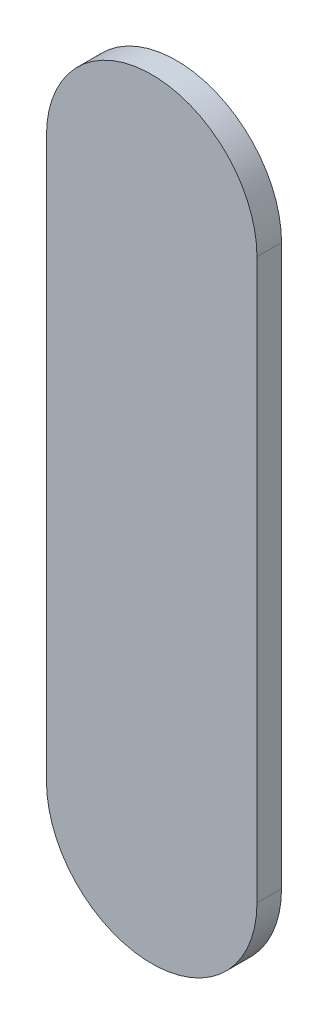
ISO-10303-21;
HEADER;
FILE_DESCRIPTION(('STEP AP214'),'2;1');
FILE_NAME('part.step','',(''),(''),'','','');
FILE_SCHEMA(('AUTOMOTIVE_DESIGN { 1 0 10303 214 1 1 1 1 }'));
ENDSEC;
DATA;
#1=APPLICATION_CONTEXT('core data for automotive mechanical design processes');
#2=APPLICATION_PROTOCOL_DEFINITION('international standard','automotive_design',2000,#1);
#3=PRODUCT_CONTEXT('',#1,'mechanical');
#4=PRODUCT('Part','Part','',(#3));
#5=PRODUCT_RELATED_PRODUCT_CATEGORY('part','',(#4));
#6=PRODUCT_DEFINITION_FORMATION('','',#4);
#7=PRODUCT_DEFINITION_CONTEXT('part definition',#1,'design');
#8=PRODUCT_DEFINITION('design','',#6,#7);
#9=PRODUCT_DEFINITION_SHAPE('','',#8);
#10=(LENGTH_UNIT() NAMED_UNIT(*) SI_UNIT(.MILLI.,.METRE.));
#11=(NAMED_UNIT(*) PLANE_ANGLE_UNIT() SI_UNIT($,.RADIAN.));
#12=(NAMED_UNIT(*) SI_UNIT($,.STERADIAN.) SOLID_ANGLE_UNIT());
#13=UNCERTAINTY_MEASURE_WITH_UNIT(LENGTH_MEASURE(1.E-05),#10,'distance_accuracy_value','');
#14=(GEOMETRIC_REPRESENTATION_CONTEXT(3) GLOBAL_UNCERTAINTY_ASSIGNED_CONTEXT((#13)) GLOBAL_UNIT_ASSIGNED_CONTEXT((#10,
#11,#12)) REPRESENTATION_CONTEXT('',''));
#15=CARTESIAN_POINT('',(0.,0.,0.));
#16=DIRECTION('',(0.,0.,1.));
#17=DIRECTION('',(1.,0.,0.));
#18=AXIS2_PLACEMENT_3D('',#15,#16,#17);
#19=CARTESIAN_POINT('',(129.85,-69.9125,1.635));
#20=DIRECTION('',(0.,0.,1.));
#21=DIRECTION('',(1.,0.,0.));
#22=AXIS2_PLACEMENT_3D('',#19,#20,#21);
#23=PLANE('',#22);
#24=DIRECTION('',(0.,-1.,0.));
#25=VECTOR('',#24,1.);
#26=CARTESIAN_POINT('',(129.85,-69.9125,1.635));
#27=LINE('',#26,#25);
#28=CARTESIAN_POINT('',(129.85,-69.9125,1.635));
#29=VERTEX_POINT('',#28);
#30=CARTESIAN_POINT('',(129.85,-70.71,1.635));
#31=VERTEX_POINT('',#30);
#32=EDGE_CURVE('E85',#29,#31,#27,.T.);
#33=ORIENTED_EDGE('',*,*,#32,.T.);
#34=CARTESIAN_POINT('',(130.,-70.71,1.635));
#35=DIRECTION('',(0.,0.,1.));
#36=DIRECTION('',(-1.,0.,0.));
#37=AXIS2_PLACEMENT_3D('',#34,#35,#36);
#38=CIRCLE('',#37,0.15);
#39=CARTESIAN_POINT('',(130.15,-70.71,1.635));
#40=VERTEX_POINT('',#39);
#41=EDGE_CURVE('E71',#31,#40,#38,.T.);
#42=ORIENTED_EDGE('',*,*,#41,.T.);
#43=DIRECTION('',(0.,1.,0.));
#44=VECTOR('',#43,1.);
#45=CARTESIAN_POINT('',(130.15,-70.71,1.635));
#46=LINE('',#45,#44);
#47=CARTESIAN_POINT('',(130.15,-69.9125,1.635));
#48=VERTEX_POINT('',#47);
#49=EDGE_CURVE('E108',#40,#48,#46,.T.);
#50=ORIENTED_EDGE('',*,*,#49,.T.);
#51=CARTESIAN_POINT('',(130.,-69.9125,1.635));
#52=DIRECTION('',(0.,0.,1.));
#53=DIRECTION('',(1.,0.,0.));
#54=AXIS2_PLACEMENT_3D('',#51,#52,#53);
#55=CIRCLE('',#54,0.15);
#56=EDGE_CURVE('E11',#48,#29,#55,.T.);
#57=ORIENTED_EDGE('',*,*,#56,.T.);
#58=EDGE_LOOP('',(#33,#42,#50,#57));
#59=FACE_BOUND('',#58,.T.);
#60=ADVANCED_FACE('F17',(#59),#23,.T.);
#61=CARTESIAN_POINT('',(129.85,-69.9125,1.6));
#62=DIRECTION('',(0.,0.,1.));
#63=DIRECTION('',(1.,0.,0.));
#64=AXIS2_PLACEMENT_3D('',#61,#62,#63);
#65=PLANE('',#64);
#66=CARTESIAN_POINT('',(130.,-69.9125,1.6));
#67=DIRECTION('',(0.,0.,1.));
#68=DIRECTION('',(1.,0.,0.));
#69=AXIS2_PLACEMENT_3D('',#66,#67,#68);
#70=CIRCLE('',#69,0.15);
#71=CARTESIAN_POINT('',(130.15,-69.9125,1.6));
#72=VERTEX_POINT('',#71);
#73=CARTESIAN_POINT('',(129.85,-69.9125,1.6));
#74=VERTEX_POINT('',#73);
#75=EDGE_CURVE('E26',#72,#74,#70,.T.);
#76=ORIENTED_EDGE('',*,*,#75,.F.);
#77=DIRECTION('',(0.,1.,0.));
#78=VECTOR('',#77,1.);
#79=CARTESIAN_POINT('',(130.15,-70.71,1.6));
#80=LINE('',#79,#78);
#81=CARTESIAN_POINT('',(130.15,-70.71,1.6));
#82=VERTEX_POINT('',#81);
#83=EDGE_CURVE('E82',#82,#72,#80,.T.);
#84=ORIENTED_EDGE('',*,*,#83,.F.);
#85=CARTESIAN_POINT('',(130.,-70.71,1.6));
#86=DIRECTION('',(0.,0.,1.));
#87=DIRECTION('',(-1.,0.,0.));
#88=AXIS2_PLACEMENT_3D('',#85,#86,#87);
#89=CIRCLE('',#88,0.15);
#90=CARTESIAN_POINT('',(129.85,-70.71,1.6));
#91=VERTEX_POINT('',#90);
#92=EDGE_CURVE('E103',#91,#82,#89,.T.);
#93=ORIENTED_EDGE('',*,*,#92,.F.);
#94=DIRECTION('',(0.,-1.,0.));
#95=VECTOR('',#94,1.);
#96=CARTESIAN_POINT('',(129.85,-69.9125,1.6));
#97=LINE('',#96,#95);
#98=EDGE_CURVE('E92',#74,#91,#97,.T.);
#99=ORIENTED_EDGE('',*,*,#98,.F.);
#100=EDGE_LOOP('',(#76,#84,#93,#99));
#101=FACE_BOUND('',#100,.T.);
#102=ADVANCED_FACE('F121',(#101),#65,.F.);
#103=CARTESIAN_POINT('',(130.,-69.9125,1.6));
#104=DIRECTION('',(0.,0.,-1.));
#105=DIRECTION('',(1.,0.,0.));
#106=AXIS2_PLACEMENT_3D('',#103,#104,#105);
#107=CYLINDRICAL_SURFACE('',#106,0.15);
#108=ORIENTED_EDGE('',*,*,#75,.T.);
#109=DIRECTION('',(0.,0.,1.));
#110=VECTOR('',#109,1.);
#111=CARTESIAN_POINT('',(129.85,-69.9125,1.6));
#112=LINE('',#111,#110);
#113=EDGE_CURVE('E89',#74,#29,#112,.T.);
#114=ORIENTED_EDGE('',*,*,#113,.T.);
#115=ORIENTED_EDGE('',*,*,#56,.F.);
#116=DIRECTION('',(0.,0.,1.));
#117=VECTOR('',#116,1.);
#118=CARTESIAN_POINT('',(130.15,-69.9125,1.6));
#119=LINE('',#118,#117);
#120=EDGE_CURVE('E113',#72,#48,#119,.T.);
#121=ORIENTED_EDGE('',*,*,#120,.F.);
#122=EDGE_LOOP('',(#108,#114,#115,#121));
#123=FACE_BOUND('',#122,.T.);
#124=ADVANCED_FACE('F19',(#123),#107,.T.);
#125=CARTESIAN_POINT('',(130.15,-70.71,1.6));
#126=DIRECTION('',(-1.,0.,0.));
#127=DIRECTION('',(0.,0.,1.));
#128=AXIS2_PLACEMENT_3D('',#125,#126,#127);
#129=PLANE('',#128);
#130=ORIENTED_EDGE('',*,*,#83,.T.);
#131=ORIENTED_EDGE('',*,*,#120,.T.);
#132=ORIENTED_EDGE('',*,*,#49,.F.);
#133=DIRECTION('',(0.,0.,1.));
#134=VECTOR('',#133,1.);
#135=CARTESIAN_POINT('',(130.15,-70.71,1.6));
#136=LINE('',#135,#134);
#137=EDGE_CURVE('E79',#82,#40,#136,.T.);
#138=ORIENTED_EDGE('',*,*,#137,.F.);
#139=EDGE_LOOP('',(#130,#131,#132,#138));
#140=FACE_BOUND('',#139,.T.);
#141=ADVANCED_FACE('F120',(#140),#129,.F.);
#142=CARTESIAN_POINT('',(130.,-70.71,1.6));
#143=DIRECTION('',(0.,0.,-1.));
#144=DIRECTION('',(-1.,0.,0.));
#145=AXIS2_PLACEMENT_3D('',#142,#143,#144);
#146=CYLINDRICAL_SURFACE('',#145,0.15);
#147=ORIENTED_EDGE('',*,*,#92,.T.);
#148=ORIENTED_EDGE('',*,*,#137,.T.);
#149=ORIENTED_EDGE('',*,*,#41,.F.);
#150=DIRECTION('',(0.,0.,1.));
#151=VECTOR('',#150,1.);
#152=CARTESIAN_POINT('',(129.85,-70.71,1.6));
#153=LINE('',#152,#151);
#154=EDGE_CURVE('E76',#91,#31,#153,.T.);
#155=ORIENTED_EDGE('',*,*,#154,.F.);
#156=EDGE_LOOP('',(#147,#148,#149,#155));
#157=FACE_BOUND('',#156,.T.);
#158=ADVANCED_FACE('F74',(#157),#146,.T.);
#159=CARTESIAN_POINT('',(129.85,-69.9125,1.6));
#160=DIRECTION('',(1.,0.,0.));
#161=DIRECTION('',(0.,1.,0.));
#162=AXIS2_PLACEMENT_3D('',#159,#160,#161);
#163=PLANE('',#162);
#164=ORIENTED_EDGE('',*,*,#98,.T.);
#165=ORIENTED_EDGE('',*,*,#154,.T.);
#166=ORIENTED_EDGE('',*,*,#32,.F.);
#167=ORIENTED_EDGE('',*,*,#113,.F.);
#168=EDGE_LOOP('',(#164,#165,#166,#167));
#169=FACE_BOUND('',#168,.T.);
#170=ADVANCED_FACE('F91',(#169),#163,.F.);
#171=CLOSED_SHELL('',(#60,#102,#124,#141,#158,#170));
#172=MANIFOLD_SOLID_BREP('B1',#171);
#173=ADVANCED_BREP_SHAPE_REPRESENTATION('',(#18,#172),#14);
#174=SHAPE_DEFINITION_REPRESENTATION(#9,#173);
ENDSEC;
END-ISO-10303-21;
